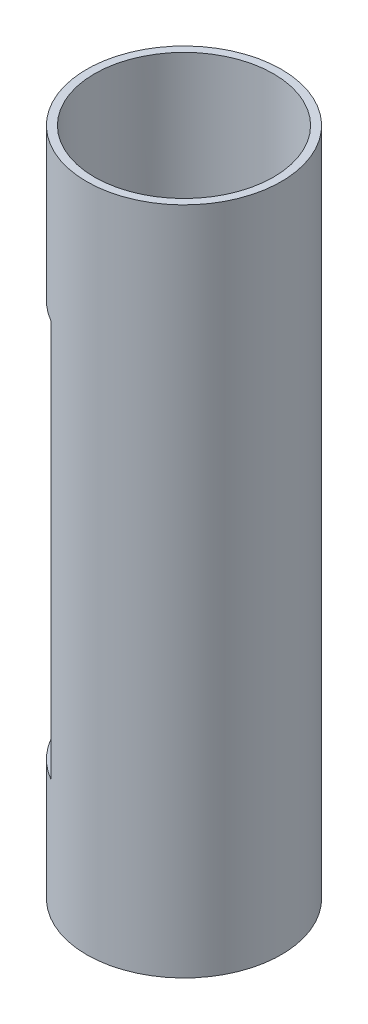
ISO-10303-21;
HEADER;
FILE_DESCRIPTION(('STEP AP214'),'2;1');
FILE_NAME('part.step','',(''),(''),'','','');
FILE_SCHEMA(('AUTOMOTIVE_DESIGN { 1 0 10303 214 1 1 1 1 }'));
ENDSEC;
DATA;
#1=APPLICATION_CONTEXT('core data for automotive mechanical design processes');
#2=APPLICATION_PROTOCOL_DEFINITION('international standard','automotive_design',2000,#1);
#3=PRODUCT_CONTEXT('',#1,'mechanical');
#4=PRODUCT('Part','Part','',(#3));
#5=PRODUCT_RELATED_PRODUCT_CATEGORY('part','',(#4));
#6=PRODUCT_DEFINITION_FORMATION('','',#4);
#7=PRODUCT_DEFINITION_CONTEXT('part definition',#1,'design');
#8=PRODUCT_DEFINITION('design','',#6,#7);
#9=PRODUCT_DEFINITION_SHAPE('','',#8);
#10=(LENGTH_UNIT() NAMED_UNIT(*) SI_UNIT(.MILLI.,.METRE.));
#11=(NAMED_UNIT(*) PLANE_ANGLE_UNIT() SI_UNIT($,.RADIAN.));
#12=(NAMED_UNIT(*) SI_UNIT($,.STERADIAN.) SOLID_ANGLE_UNIT());
#13=UNCERTAINTY_MEASURE_WITH_UNIT(LENGTH_MEASURE(1.E-05),#10,'distance_accuracy_value','');
#14=(GEOMETRIC_REPRESENTATION_CONTEXT(3) GLOBAL_UNCERTAINTY_ASSIGNED_CONTEXT((#13)) GLOBAL_UNIT_ASSIGNED_CONTEXT((#10,
#11,#12)) REPRESENTATION_CONTEXT('',''));
#15=CARTESIAN_POINT('',(0.,0.,0.));
#16=DIRECTION('',(0.,0.,1.));
#17=DIRECTION('',(1.,0.,0.));
#18=AXIS2_PLACEMENT_3D('',#15,#16,#17);
#19=CARTESIAN_POINT('',(0.,172.,0.));
#20=DIRECTION('',(0.,1.,0.));
#21=DIRECTION('',(0.,0.,1.));
#22=AXIS2_PLACEMENT_3D('',#19,#20,#21);
#23=PLANE('',#22);
#24=CARTESIAN_POINT('',(0.,172.,0.));
#25=DIRECTION('',(0.,1.,0.));
#26=DIRECTION('',(0.,0.,1.));
#27=AXIS2_PLACEMENT_3D('',#24,#25,#26);
#28=CIRCLE('',#27,25.);
#29=CARTESIAN_POINT('',(0.,172.,25.));
#30=VERTEX_POINT('',#29);
#31=EDGE_CURVE('E106',#30,#30,#28,.T.);
#32=ORIENTED_EDGE('',*,*,#31,.T.);
#33=EDGE_LOOP('',(#32));
#34=FACE_BOUND('',#33,.T.);
#35=CARTESIAN_POINT('',(0.,172.,0.));
#36=DIRECTION('',(0.,1.,0.));
#37=DIRECTION('',(0.,0.,1.));
#38=AXIS2_PLACEMENT_3D('',#35,#36,#37);
#39=CIRCLE('',#38,23.);
#40=CARTESIAN_POINT('',(0.,172.,23.));
#41=VERTEX_POINT('',#40);
#42=EDGE_CURVE('E98',#41,#41,#39,.T.);
#43=ORIENTED_EDGE('',*,*,#42,.F.);
#44=EDGE_LOOP('',(#43));
#45=FACE_BOUND('',#44,.T.);
#46=ADVANCED_FACE('F39',(#34,#45),#23,.T.);
#47=CARTESIAN_POINT('',(0.,0.,0.));
#48=DIRECTION('',(0.,1.,0.));
#49=DIRECTION('',(0.,0.,1.));
#50=AXIS2_PLACEMENT_3D('',#47,#48,#49);
#51=PLANE('',#50);
#52=CARTESIAN_POINT('',(0.,0.,0.));
#53=DIRECTION('',(0.,1.,0.));
#54=DIRECTION('',(0.,0.,1.));
#55=AXIS2_PLACEMENT_3D('',#52,#53,#54);
#56=CIRCLE('',#55,25.);
#57=CARTESIAN_POINT('',(0.,0.,25.));
#58=VERTEX_POINT('',#57);
#59=EDGE_CURVE('E104',#58,#58,#56,.T.);
#60=ORIENTED_EDGE('',*,*,#59,.F.);
#61=EDGE_LOOP('',(#60));
#62=FACE_BOUND('',#61,.T.);
#63=CARTESIAN_POINT('',(0.,0.,0.));
#64=DIRECTION('',(0.,1.,0.));
#65=DIRECTION('',(0.,0.,1.));
#66=AXIS2_PLACEMENT_3D('',#63,#64,#65);
#67=CIRCLE('',#66,23.);
#68=CARTESIAN_POINT('',(0.,0.,23.));
#69=VERTEX_POINT('',#68);
#70=EDGE_CURVE('E94',#69,#69,#67,.T.);
#71=ORIENTED_EDGE('',*,*,#70,.T.);
#72=EDGE_LOOP('',(#71));
#73=FACE_BOUND('',#72,.T.);
#74=ADVANCED_FACE('F133',(#62,#73),#51,.F.);
#75=CARTESIAN_POINT('',(0.,172.,0.));
#76=DIRECTION('',(0.,-1.,0.));
#77=DIRECTION('',(0.,0.,-1.));
#78=AXIS2_PLACEMENT_3D('',#75,#76,#77);
#79=CYLINDRICAL_SURFACE('',#78,25.);
#80=DIRECTION('',(0.,-1.,0.));
#81=VECTOR('',#80,1.);
#82=CARTESIAN_POINT('',(-12.4999999999999,172.,-21.650635094611));
#83=LINE('',#82,#81);
#84=CARTESIAN_POINT('',(-12.4999999999999,31.,-21.650635094611));
#85=VERTEX_POINT('',#84);
#86=CARTESIAN_POINT('',(-12.4999999999999,133.,-21.650635094611));
#87=VERTEX_POINT('',#86);
#88=EDGE_CURVE('E95',#85,#87,#83,.F.);
#89=ORIENTED_EDGE('',*,*,#88,.T.);
#90=CARTESIAN_POINT('',(0.,133.,0.));
#91=DIRECTION('',(0.,1.,0.));
#92=DIRECTION('',(0.,0.,1.));
#93=AXIS2_PLACEMENT_3D('',#90,#91,#92);
#94=CIRCLE('',#93,25.);
#95=CARTESIAN_POINT('',(-12.5000000000001,133.,21.6506350946109));
#96=VERTEX_POINT('',#95);
#97=EDGE_CURVE('E81',#87,#96,#94,.T.);
#98=ORIENTED_EDGE('',*,*,#97,.T.);
#99=DIRECTION('',(0.,-1.,0.));
#100=VECTOR('',#99,1.);
#101=CARTESIAN_POINT('',(-12.5000000000001,172.,21.6506350946109));
#102=LINE('',#101,#100);
#103=CARTESIAN_POINT('',(-12.5000000000001,31.,21.6506350946109));
#104=VERTEX_POINT('',#103);
#105=EDGE_CURVE('E87',#96,#104,#102,.T.);
#106=ORIENTED_EDGE('',*,*,#105,.T.);
#107=CARTESIAN_POINT('',(0.,31.,0.));
#108=DIRECTION('',(0.,1.,0.));
#109=DIRECTION('',(0.,0.,1.));
#110=AXIS2_PLACEMENT_3D('',#107,#108,#109);
#111=CIRCLE('',#110,25.);
#112=EDGE_CURVE('E76',#85,#104,#111,.T.);
#113=ORIENTED_EDGE('',*,*,#112,.F.);
#114=EDGE_LOOP('',(#89,#98,#106,#113));
#115=FACE_BOUND('',#114,.T.);
#116=ORIENTED_EDGE('',*,*,#31,.F.);
#117=EDGE_LOOP('',(#116));
#118=FACE_BOUND('',#117,.T.);
#119=ORIENTED_EDGE('',*,*,#59,.T.);
#120=EDGE_LOOP('',(#119));
#121=FACE_BOUND('',#120,.T.);
#122=ADVANCED_FACE('F41',(#115,#118,#121),#79,.T.);
#123=CARTESIAN_POINT('',(0.,172.,0.));
#124=DIRECTION('',(0.,-1.,0.));
#125=DIRECTION('',(0.,0.,-1.));
#126=AXIS2_PLACEMENT_3D('',#123,#124,#125);
#127=CYLINDRICAL_SURFACE('',#126,23.);
#128=CARTESIAN_POINT('',(0.,133.,0.));
#129=DIRECTION('',(0.,1.,0.));
#130=DIRECTION('',(0.,0.,1.));
#131=AXIS2_PLACEMENT_3D('',#128,#129,#130);
#132=CIRCLE('',#131,23.);
#133=CARTESIAN_POINT('',(-11.5,133.,-19.9185842870421));
#134=VERTEX_POINT('',#133);
#135=CARTESIAN_POINT('',(-11.5000000000001,133.,19.918584287042));
#136=VERTEX_POINT('',#135);
#137=EDGE_CURVE('E11',#134,#136,#132,.T.);
#138=ORIENTED_EDGE('',*,*,#137,.F.);
#139=DIRECTION('',(0.,-1.,0.));
#140=VECTOR('',#139,1.);
#141=CARTESIAN_POINT('',(-11.4999999999999,172.,-19.9185842870421));
#142=LINE('',#141,#140);
#143=CARTESIAN_POINT('',(-11.5,31.,-19.9185842870421));
#144=VERTEX_POINT('',#143);
#145=EDGE_CURVE('E113',#144,#134,#142,.F.);
#146=ORIENTED_EDGE('',*,*,#145,.F.);
#147=CARTESIAN_POINT('',(0.,31.,0.));
#148=DIRECTION('',(0.,1.,0.));
#149=DIRECTION('',(0.,0.,1.));
#150=AXIS2_PLACEMENT_3D('',#147,#148,#149);
#151=CIRCLE('',#150,23.);
#152=CARTESIAN_POINT('',(-11.5000000000001,31.,19.918584287042));
#153=VERTEX_POINT('',#152);
#154=EDGE_CURVE('E109',#144,#153,#151,.T.);
#155=ORIENTED_EDGE('',*,*,#154,.T.);
#156=DIRECTION('',(0.,-1.,0.));
#157=VECTOR('',#156,1.);
#158=CARTESIAN_POINT('',(-11.5000000000001,172.,19.918584287042));
#159=LINE('',#158,#157);
#160=EDGE_CURVE('E47',#136,#153,#159,.T.);
#161=ORIENTED_EDGE('',*,*,#160,.F.);
#162=EDGE_LOOP('',(#138,#146,#155,#161));
#163=FACE_BOUND('',#162,.T.);
#164=ORIENTED_EDGE('',*,*,#42,.T.);
#165=EDGE_LOOP('',(#164));
#166=FACE_BOUND('',#165,.T.);
#167=ORIENTED_EDGE('',*,*,#70,.F.);
#168=EDGE_LOOP('',(#167));
#169=FACE_BOUND('',#168,.T.);
#170=ADVANCED_FACE('F125',(#163,#166,#169),#127,.F.);
#171=CARTESIAN_POINT('',(-33.4527899575794,133.,57.9419318614568));
#172=DIRECTION('',(0.866025403784436,0.,0.500000000000004));
#173=DIRECTION('',(0.500000000000004,0.,-0.866025403784436));
#174=AXIS2_PLACEMENT_3D('',#171,#172,#173);
#175=PLANE('',#174);
#176=DIRECTION('',(-0.500000000000004,0.,0.866025403784436));
#177=VECTOR('',#176,1.);
#178=CARTESIAN_POINT('',(-33.4527899575794,133.,57.9419318614568));
#179=LINE('',#178,#177);
#180=EDGE_CURVE('E123',#136,#96,#179,.T.);
#181=ORIENTED_EDGE('',*,*,#180,.F.);
#182=ORIENTED_EDGE('',*,*,#160,.T.);
#183=DIRECTION('',(-0.500000000000004,0.,0.866025403784436));
#184=VECTOR('',#183,1.);
#185=CARTESIAN_POINT('',(-33.4527899575794,31.,57.9419318614568));
#186=LINE('',#185,#184);
#187=EDGE_CURVE('E59',#153,#104,#186,.T.);
#188=ORIENTED_EDGE('',*,*,#187,.T.);
#189=ORIENTED_EDGE('',*,*,#105,.F.);
#190=EDGE_LOOP('',(#181,#182,#188,#189));
#191=FACE_BOUND('',#190,.T.);
#192=ADVANCED_FACE('F86',(#191),#175,.F.);
#193=CARTESIAN_POINT('',(0.,133.,0.));
#194=DIRECTION('',(0.86602540378444,0.,-0.499999999999998));
#195=DIRECTION('',(-0.499999999999998,0.,-0.86602540378444));
#196=AXIS2_PLACEMENT_3D('',#193,#194,#195);
#197=PLANE('',#196);
#198=DIRECTION('',(0.499999999999998,0.,0.86602540378444));
#199=VECTOR('',#198,1.);
#200=CARTESIAN_POINT('',(0.,31.,0.));
#201=LINE('',#200,#199);
#202=EDGE_CURVE('E54',#85,#144,#201,.T.);
#203=ORIENTED_EDGE('',*,*,#202,.T.);
#204=ORIENTED_EDGE('',*,*,#145,.T.);
#205=DIRECTION('',(0.499999999999998,0.,0.86602540378444));
#206=VECTOR('',#205,1.);
#207=CARTESIAN_POINT('',(0.,133.,0.));
#208=LINE('',#207,#206);
#209=EDGE_CURVE('E82',#87,#134,#208,.T.);
#210=ORIENTED_EDGE('',*,*,#209,.F.);
#211=ORIENTED_EDGE('',*,*,#88,.F.);
#212=EDGE_LOOP('',(#203,#204,#210,#211));
#213=FACE_BOUND('',#212,.T.);
#214=ADVANCED_FACE('F118',(#213),#197,.F.);
#215=CARTESIAN_POINT('',(0.,133.,0.));
#216=DIRECTION('',(0.,1.,0.));
#217=DIRECTION('',(0.,0.,1.));
#218=AXIS2_PLACEMENT_3D('',#215,#216,#217);
#219=PLANE('',#218);
#220=ORIENTED_EDGE('',*,*,#209,.T.);
#221=ORIENTED_EDGE('',*,*,#137,.T.);
#222=ORIENTED_EDGE('',*,*,#180,.T.);
#223=ORIENTED_EDGE('',*,*,#97,.F.);
#224=EDGE_LOOP('',(#220,#221,#222,#223));
#225=FACE_BOUND('',#224,.T.);
#226=ADVANCED_FACE('F122',(#225),#219,.F.);
#227=CARTESIAN_POINT('',(0.,31.,0.));
#228=DIRECTION('',(0.,1.,0.));
#229=DIRECTION('',(0.,0.,1.));
#230=AXIS2_PLACEMENT_3D('',#227,#228,#229);
#231=PLANE('',#230);
#232=ORIENTED_EDGE('',*,*,#112,.T.);
#233=ORIENTED_EDGE('',*,*,#187,.F.);
#234=ORIENTED_EDGE('',*,*,#154,.F.);
#235=ORIENTED_EDGE('',*,*,#202,.F.);
#236=EDGE_LOOP('',(#232,#233,#234,#235));
#237=FACE_BOUND('',#236,.T.);
#238=ADVANCED_FACE('F77',(#237),#231,.T.);
#239=CLOSED_SHELL('',(#46,#74,#122,#170,#192,#214,#226,#238));
#240=MANIFOLD_SOLID_BREP('B2',#239);
#241=ADVANCED_BREP_SHAPE_REPRESENTATION('',(#18,#240),#14);
#242=SHAPE_DEFINITION_REPRESENTATION(#9,#241);
ENDSEC;
END-ISO-10303-21;
